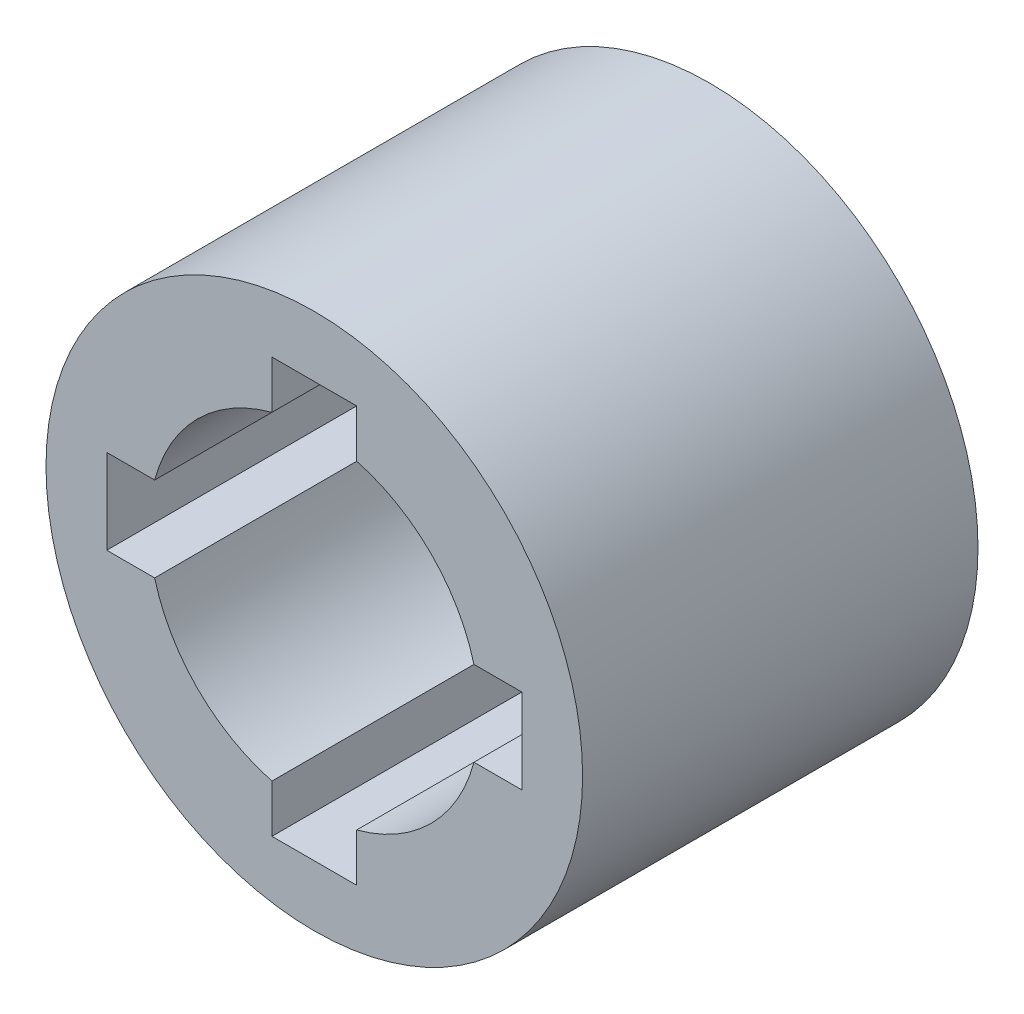
ISO-10303-21;
HEADER;
FILE_DESCRIPTION(('STEP AP214'),'2;1');
FILE_NAME('part.step','',(''),(''),'','','');
FILE_SCHEMA(('AUTOMOTIVE_DESIGN { 1 0 10303 214 1 1 1 1 }'));
ENDSEC;
DATA;
#1=APPLICATION_CONTEXT('core data for automotive mechanical design processes');
#2=APPLICATION_PROTOCOL_DEFINITION('international standard','automotive_design',2000,#1);
#3=PRODUCT_CONTEXT('',#1,'mechanical');
#4=PRODUCT('Part','Part','',(#3));
#5=PRODUCT_RELATED_PRODUCT_CATEGORY('part','',(#4));
#6=PRODUCT_DEFINITION_FORMATION('','',#4);
#7=PRODUCT_DEFINITION_CONTEXT('part definition',#1,'design');
#8=PRODUCT_DEFINITION('design','',#6,#7);
#9=PRODUCT_DEFINITION_SHAPE('','',#8);
#10=(LENGTH_UNIT() NAMED_UNIT(*) SI_UNIT(.MILLI.,.METRE.));
#11=(NAMED_UNIT(*) PLANE_ANGLE_UNIT() SI_UNIT($,.RADIAN.));
#12=(NAMED_UNIT(*) SI_UNIT($,.STERADIAN.) SOLID_ANGLE_UNIT());
#13=UNCERTAINTY_MEASURE_WITH_UNIT(LENGTH_MEASURE(1.E-05),#10,'distance_accuracy_value','');
#14=(GEOMETRIC_REPRESENTATION_CONTEXT(3) GLOBAL_UNCERTAINTY_ASSIGNED_CONTEXT((#13)) GLOBAL_UNIT_ASSIGNED_CONTEXT((#10,
#11,#12)) REPRESENTATION_CONTEXT('',''));
#15=CARTESIAN_POINT('',(0.,0.,0.));
#16=DIRECTION('',(0.,0.,1.));
#17=DIRECTION('',(1.,0.,0.));
#18=AXIS2_PLACEMENT_3D('',#15,#16,#17);
#19=CARTESIAN_POINT('',(0.,0.,14.));
#20=DIRECTION('',(0.,0.,1.));
#21=DIRECTION('',(1.,0.,0.));
#22=AXIS2_PLACEMENT_3D('',#19,#20,#21);
#23=PLANE('',#22);
#24=CARTESIAN_POINT('',(0.,0.,14.));
#25=DIRECTION('',(0.,0.,1.));
#26=DIRECTION('',(1.,0.,0.));
#27=AXIS2_PLACEMENT_3D('',#24,#25,#26);
#28=CIRCLE('',#27,9.5);
#29=CARTESIAN_POINT('',(9.5,0.,14.));
#30=VERTEX_POINT('',#29);
#31=EDGE_CURVE('E11',#30,#30,#28,.T.);
#32=ORIENTED_EDGE('',*,*,#31,.T.);
#33=EDGE_LOOP('',(#32));
#34=FACE_BOUND('',#33,.T.);
#35=DIRECTION('',(-1.,0.,0.));
#36=VECTOR('',#35,1.);
#37=CARTESIAN_POINT('',(-1.5,7.34846922834954,14.));
#38=LINE('',#37,#36);
#39=CARTESIAN_POINT('',(1.5,7.34846922834954,14.));
#40=VERTEX_POINT('',#39);
#41=CARTESIAN_POINT('',(-1.5,7.34846922834954,14.));
#42=VERTEX_POINT('',#41);
#43=EDGE_CURVE('E160',#40,#42,#38,.T.);
#44=ORIENTED_EDGE('',*,*,#43,.F.);
#45=DIRECTION('',(0.,1.,0.));
#46=VECTOR('',#45,1.);
#47=CARTESIAN_POINT('',(1.5,7.34846922834954,14.));
#48=LINE('',#47,#46);
#49=CARTESIAN_POINT('',(1.5,5.65283931444645,14.));
#50=VERTEX_POINT('',#49);
#51=EDGE_CURVE('E152',#50,#40,#48,.T.);
#52=ORIENTED_EDGE('',*,*,#51,.F.);
#53=CARTESIAN_POINT('',(0.,0.,14.));
#54=DIRECTION('',(0.,0.,1.));
#55=DIRECTION('',(1.,0.,0.));
#56=AXIS2_PLACEMENT_3D('',#53,#54,#55);
#57=CIRCLE('',#56,5.84846922834954);
#58=CARTESIAN_POINT('',(5.65283931444645,1.5,14.));
#59=VERTEX_POINT('',#58);
#60=EDGE_CURVE('E200',#59,#50,#57,.T.);
#61=ORIENTED_EDGE('',*,*,#60,.F.);
#62=DIRECTION('',(-1.,0.,0.));
#63=VECTOR('',#62,1.);
#64=CARTESIAN_POINT('',(5.65283931444645,1.5,14.));
#65=LINE('',#64,#63);
#66=CARTESIAN_POINT('',(7.34846922834954,1.5,14.));
#67=VERTEX_POINT('',#66);
#68=EDGE_CURVE('E198',#67,#59,#65,.T.);
#69=ORIENTED_EDGE('',*,*,#68,.F.);
#70=DIRECTION('',(0.,1.,0.));
#71=VECTOR('',#70,1.);
#72=CARTESIAN_POINT('',(7.34846922834954,1.5,14.));
#73=LINE('',#72,#71);
#74=CARTESIAN_POINT('',(7.34846922834954,-1.5,14.));
#75=VERTEX_POINT('',#74);
#76=EDGE_CURVE('E196',#75,#67,#73,.T.);
#77=ORIENTED_EDGE('',*,*,#76,.F.);
#78=DIRECTION('',(1.,0.,0.));
#79=VECTOR('',#78,1.);
#80=CARTESIAN_POINT('',(7.34846922834954,-1.5,14.));
#81=LINE('',#80,#79);
#82=CARTESIAN_POINT('',(5.65283931444645,-1.5,14.));
#83=VERTEX_POINT('',#82);
#84=EDGE_CURVE('E194',#83,#75,#81,.T.);
#85=ORIENTED_EDGE('',*,*,#84,.F.);
#86=CARTESIAN_POINT('',(0.,0.,14.));
#87=DIRECTION('',(0.,0.,1.));
#88=DIRECTION('',(1.,0.,0.));
#89=AXIS2_PLACEMENT_3D('',#86,#87,#88);
#90=CIRCLE('',#89,5.84846922834954);
#91=CARTESIAN_POINT('',(1.5,-5.65283931444645,14.));
#92=VERTEX_POINT('',#91);
#93=EDGE_CURVE('E192',#92,#83,#90,.T.);
#94=ORIENTED_EDGE('',*,*,#93,.F.);
#95=DIRECTION('',(0.,1.,0.));
#96=VECTOR('',#95,1.);
#97=CARTESIAN_POINT('',(1.5,-5.65283931444645,14.));
#98=LINE('',#97,#96);
#99=CARTESIAN_POINT('',(1.5,-7.34846922834954,14.));
#100=VERTEX_POINT('',#99);
#101=EDGE_CURVE('E190',#100,#92,#98,.T.);
#102=ORIENTED_EDGE('',*,*,#101,.F.);
#103=DIRECTION('',(1.,0.,0.));
#104=VECTOR('',#103,1.);
#105=CARTESIAN_POINT('',(1.5,-7.34846922834954,14.));
#106=LINE('',#105,#104);
#107=CARTESIAN_POINT('',(-1.5,-7.34846922834954,14.));
#108=VERTEX_POINT('',#107);
#109=EDGE_CURVE('E188',#108,#100,#106,.T.);
#110=ORIENTED_EDGE('',*,*,#109,.F.);
#111=DIRECTION('',(0.,-1.,0.));
#112=VECTOR('',#111,1.);
#113=CARTESIAN_POINT('',(-1.5,-7.34846922834954,14.));
#114=LINE('',#113,#112);
#115=CARTESIAN_POINT('',(-1.5,-5.65283931444645,14.));
#116=VERTEX_POINT('',#115);
#117=EDGE_CURVE('E186',#116,#108,#114,.T.);
#118=ORIENTED_EDGE('',*,*,#117,.F.);
#119=CARTESIAN_POINT('',(0.,0.,14.));
#120=DIRECTION('',(0.,0.,1.));
#121=DIRECTION('',(1.,0.,0.));
#122=AXIS2_PLACEMENT_3D('',#119,#120,#121);
#123=CIRCLE('',#122,5.84846922834954);
#124=CARTESIAN_POINT('',(-5.65283931444645,-1.5,14.));
#125=VERTEX_POINT('',#124);
#126=EDGE_CURVE('E184',#125,#116,#123,.T.);
#127=ORIENTED_EDGE('',*,*,#126,.F.);
#128=DIRECTION('',(1.,0.,0.));
#129=VECTOR('',#128,1.);
#130=CARTESIAN_POINT('',(-5.65283931444645,-1.5,14.));
#131=LINE('',#130,#129);
#132=CARTESIAN_POINT('',(-7.34846922834954,-1.5,14.));
#133=VERTEX_POINT('',#132);
#134=EDGE_CURVE('E182',#133,#125,#131,.T.);
#135=ORIENTED_EDGE('',*,*,#134,.F.);
#136=DIRECTION('',(0.,-1.,0.));
#137=VECTOR('',#136,1.);
#138=CARTESIAN_POINT('',(-7.34846922834954,-1.5,14.));
#139=LINE('',#138,#137);
#140=CARTESIAN_POINT('',(-7.34846922834954,1.5,14.));
#141=VERTEX_POINT('',#140);
#142=EDGE_CURVE('E180',#141,#133,#139,.T.);
#143=ORIENTED_EDGE('',*,*,#142,.F.);
#144=DIRECTION('',(-1.,0.,0.));
#145=VECTOR('',#144,1.);
#146=CARTESIAN_POINT('',(-7.34846922834954,1.5,14.));
#147=LINE('',#146,#145);
#148=CARTESIAN_POINT('',(-5.65283931444645,1.5,14.));
#149=VERTEX_POINT('',#148);
#150=EDGE_CURVE('E178',#149,#141,#147,.T.);
#151=ORIENTED_EDGE('',*,*,#150,.F.);
#152=CARTESIAN_POINT('',(0.,0.,14.));
#153=DIRECTION('',(0.,0.,1.));
#154=DIRECTION('',(1.,0.,0.));
#155=AXIS2_PLACEMENT_3D('',#152,#153,#154);
#156=CIRCLE('',#155,5.84846922834954);
#157=CARTESIAN_POINT('',(-1.5,5.65283931444645,14.));
#158=VERTEX_POINT('',#157);
#159=EDGE_CURVE('E174',#158,#149,#156,.T.);
#160=ORIENTED_EDGE('',*,*,#159,.F.);
#161=DIRECTION('',(0.,-1.,0.));
#162=VECTOR('',#161,1.);
#163=CARTESIAN_POINT('',(-1.5,5.65283931444645,14.));
#164=LINE('',#163,#162);
#165=EDGE_CURVE('E172',#42,#158,#164,.T.);
#166=ORIENTED_EDGE('',*,*,#165,.F.);
#167=EDGE_LOOP('',(#44,#52,#61,#69,#77,#85,#94,#102,#110,#118,#127,#135,#143,#151,#160,#166));
#168=FACE_BOUND('',#167,.T.);
#169=ADVANCED_FACE('F39',(#34,#168),#23,.T.);
#170=CARTESIAN_POINT('',(0.,0.,0.));
#171=DIRECTION('',(0.,0.,1.));
#172=DIRECTION('',(1.,0.,0.));
#173=AXIS2_PLACEMENT_3D('',#170,#171,#172);
#174=PLANE('',#173);
#175=CARTESIAN_POINT('',(0.,0.,0.));
#176=DIRECTION('',(0.,0.,1.));
#177=DIRECTION('',(1.,0.,0.));
#178=AXIS2_PLACEMENT_3D('',#175,#176,#177);
#179=CIRCLE('',#178,9.5);
#180=CARTESIAN_POINT('',(9.5,0.,0.));
#181=VERTEX_POINT('',#180);
#182=EDGE_CURVE('E43',#181,#181,#179,.T.);
#183=ORIENTED_EDGE('',*,*,#182,.F.);
#184=EDGE_LOOP('',(#183));
#185=FACE_BOUND('',#184,.T.);
#186=DIRECTION('',(0.,1.,0.));
#187=VECTOR('',#186,1.);
#188=CARTESIAN_POINT('',(1.5,7.34846922834954,0.));
#189=LINE('',#188,#187);
#190=CARTESIAN_POINT('',(1.5,5.65283931444645,0.));
#191=VERTEX_POINT('',#190);
#192=CARTESIAN_POINT('',(1.5,7.34846922834954,0.));
#193=VERTEX_POINT('',#192);
#194=EDGE_CURVE('E62',#191,#193,#189,.T.);
#195=ORIENTED_EDGE('',*,*,#194,.T.);
#196=DIRECTION('',(-1.,0.,0.));
#197=VECTOR('',#196,1.);
#198=CARTESIAN_POINT('',(-1.5,7.34846922834954,0.));
#199=LINE('',#198,#197);
#200=CARTESIAN_POINT('',(-1.5,7.34846922834954,0.));
#201=VERTEX_POINT('',#200);
#202=EDGE_CURVE('E167',#193,#201,#199,.T.);
#203=ORIENTED_EDGE('',*,*,#202,.T.);
#204=DIRECTION('',(0.,-1.,0.));
#205=VECTOR('',#204,1.);
#206=CARTESIAN_POINT('',(-1.5,5.65283931444645,0.));
#207=LINE('',#206,#205);
#208=CARTESIAN_POINT('',(-1.5,5.65283931444645,0.));
#209=VERTEX_POINT('',#208);
#210=EDGE_CURVE('E204',#201,#209,#207,.T.);
#211=ORIENTED_EDGE('',*,*,#210,.T.);
#212=CARTESIAN_POINT('',(0.,0.,0.));
#213=DIRECTION('',(0.,0.,1.));
#214=DIRECTION('',(1.,0.,0.));
#215=AXIS2_PLACEMENT_3D('',#212,#213,#214);
#216=CIRCLE('',#215,5.84846922834954);
#217=CARTESIAN_POINT('',(-5.65283931444645,1.5,0.));
#218=VERTEX_POINT('',#217);
#219=EDGE_CURVE('E207',#209,#218,#216,.T.);
#220=ORIENTED_EDGE('',*,*,#219,.T.);
#221=DIRECTION('',(-1.,0.,0.));
#222=VECTOR('',#221,1.);
#223=CARTESIAN_POINT('',(-7.34846922834954,1.5,0.));
#224=LINE('',#223,#222);
#225=CARTESIAN_POINT('',(-7.34846922834954,1.5,0.));
#226=VERTEX_POINT('',#225);
#227=EDGE_CURVE('E210',#218,#226,#224,.T.);
#228=ORIENTED_EDGE('',*,*,#227,.T.);
#229=DIRECTION('',(0.,-1.,0.));
#230=VECTOR('',#229,1.);
#231=CARTESIAN_POINT('',(-7.34846922834954,-1.5,0.));
#232=LINE('',#231,#230);
#233=CARTESIAN_POINT('',(-7.34846922834954,-1.5,0.));
#234=VERTEX_POINT('',#233);
#235=EDGE_CURVE('E213',#226,#234,#232,.T.);
#236=ORIENTED_EDGE('',*,*,#235,.T.);
#237=DIRECTION('',(1.,0.,0.));
#238=VECTOR('',#237,1.);
#239=CARTESIAN_POINT('',(-5.65283931444645,-1.5,0.));
#240=LINE('',#239,#238);
#241=CARTESIAN_POINT('',(-5.65283931444645,-1.5,0.));
#242=VERTEX_POINT('',#241);
#243=EDGE_CURVE('E216',#234,#242,#240,.T.);
#244=ORIENTED_EDGE('',*,*,#243,.T.);
#245=CARTESIAN_POINT('',(0.,0.,0.));
#246=DIRECTION('',(0.,0.,1.));
#247=DIRECTION('',(1.,0.,0.));
#248=AXIS2_PLACEMENT_3D('',#245,#246,#247);
#249=CIRCLE('',#248,5.84846922834954);
#250=CARTESIAN_POINT('',(-1.5,-5.65283931444645,0.));
#251=VERTEX_POINT('',#250);
#252=EDGE_CURVE('E219',#242,#251,#249,.T.);
#253=ORIENTED_EDGE('',*,*,#252,.T.);
#254=DIRECTION('',(0.,-1.,0.));
#255=VECTOR('',#254,1.);
#256=CARTESIAN_POINT('',(-1.5,-7.34846922834954,0.));
#257=LINE('',#256,#255);
#258=CARTESIAN_POINT('',(-1.5,-7.34846922834954,0.));
#259=VERTEX_POINT('',#258);
#260=EDGE_CURVE('E222',#251,#259,#257,.T.);
#261=ORIENTED_EDGE('',*,*,#260,.T.);
#262=DIRECTION('',(1.,0.,0.));
#263=VECTOR('',#262,1.);
#264=CARTESIAN_POINT('',(1.5,-7.34846922834954,0.));
#265=LINE('',#264,#263);
#266=CARTESIAN_POINT('',(1.5,-7.34846922834954,0.));
#267=VERTEX_POINT('',#266);
#268=EDGE_CURVE('E225',#259,#267,#265,.T.);
#269=ORIENTED_EDGE('',*,*,#268,.T.);
#270=DIRECTION('',(0.,1.,0.));
#271=VECTOR('',#270,1.);
#272=CARTESIAN_POINT('',(1.5,-5.65283931444645,0.));
#273=LINE('',#272,#271);
#274=CARTESIAN_POINT('',(1.5,-5.65283931444645,0.));
#275=VERTEX_POINT('',#274);
#276=EDGE_CURVE('E228',#267,#275,#273,.T.);
#277=ORIENTED_EDGE('',*,*,#276,.T.);
#278=CARTESIAN_POINT('',(0.,0.,0.));
#279=DIRECTION('',(0.,0.,1.));
#280=DIRECTION('',(1.,0.,0.));
#281=AXIS2_PLACEMENT_3D('',#278,#279,#280);
#282=CIRCLE('',#281,5.84846922834954);
#283=CARTESIAN_POINT('',(5.65283931444645,-1.5,0.));
#284=VERTEX_POINT('',#283);
#285=EDGE_CURVE('E231',#275,#284,#282,.T.);
#286=ORIENTED_EDGE('',*,*,#285,.T.);
#287=DIRECTION('',(1.,0.,0.));
#288=VECTOR('',#287,1.);
#289=CARTESIAN_POINT('',(7.34846922834954,-1.5,0.));
#290=LINE('',#289,#288);
#291=CARTESIAN_POINT('',(7.34846922834954,-1.5,0.));
#292=VERTEX_POINT('',#291);
#293=EDGE_CURVE('E234',#284,#292,#290,.T.);
#294=ORIENTED_EDGE('',*,*,#293,.T.);
#295=DIRECTION('',(0.,1.,0.));
#296=VECTOR('',#295,1.);
#297=CARTESIAN_POINT('',(7.34846922834954,1.5,0.));
#298=LINE('',#297,#296);
#299=CARTESIAN_POINT('',(7.34846922834954,1.5,0.));
#300=VERTEX_POINT('',#299);
#301=EDGE_CURVE('E237',#292,#300,#298,.T.);
#302=ORIENTED_EDGE('',*,*,#301,.T.);
#303=DIRECTION('',(-1.,0.,0.));
#304=VECTOR('',#303,1.);
#305=CARTESIAN_POINT('',(5.65283931444645,1.5,0.));
#306=LINE('',#305,#304);
#307=CARTESIAN_POINT('',(5.65283931444645,1.5,0.));
#308=VERTEX_POINT('',#307);
#309=EDGE_CURVE('E240',#300,#308,#306,.T.);
#310=ORIENTED_EDGE('',*,*,#309,.T.);
#311=CARTESIAN_POINT('',(0.,0.,0.));
#312=DIRECTION('',(0.,0.,1.));
#313=DIRECTION('',(1.,0.,0.));
#314=AXIS2_PLACEMENT_3D('',#311,#312,#313);
#315=CIRCLE('',#314,5.84846922834954);
#316=EDGE_CURVE('E161',#308,#191,#315,.T.);
#317=ORIENTED_EDGE('',*,*,#316,.T.);
#318=EDGE_LOOP('',(#195,#203,#211,#220,#228,#236,#244,#253,#261,#269,#277,#286,#294,#302,#310,#317));
#319=FACE_BOUND('',#318,.T.);
#320=ADVANCED_FACE('F277',(#185,#319),#174,.F.);
#321=CARTESIAN_POINT('',(0.,0.,14.));
#322=DIRECTION('',(0.,0.,-1.));
#323=DIRECTION('',(-1.,0.,0.));
#324=AXIS2_PLACEMENT_3D('',#321,#322,#323);
#325=CYLINDRICAL_SURFACE('',#324,9.5);
#326=ORIENTED_EDGE('',*,*,#31,.F.);
#327=EDGE_LOOP('',(#326));
#328=FACE_BOUND('',#327,.T.);
#329=ORIENTED_EDGE('',*,*,#182,.T.);
#330=EDGE_LOOP('',(#329));
#331=FACE_BOUND('',#330,.T.);
#332=ADVANCED_FACE('F41',(#328,#331),#325,.T.);
#333=CARTESIAN_POINT('',(1.5,7.34846922834954,14.));
#334=DIRECTION('',(-1.,0.,0.));
#335=DIRECTION('',(0.,0.,1.));
#336=AXIS2_PLACEMENT_3D('',#333,#334,#335);
#337=PLANE('',#336);
#338=ORIENTED_EDGE('',*,*,#194,.F.);
#339=DIRECTION('',(0.,0.,-1.));
#340=VECTOR('',#339,1.);
#341=CARTESIAN_POINT('',(1.5,5.65283931444645,14.));
#342=LINE('',#341,#340);
#343=EDGE_CURVE('E156',#50,#191,#342,.T.);
#344=ORIENTED_EDGE('',*,*,#343,.F.);
#345=ORIENTED_EDGE('',*,*,#51,.T.);
#346=DIRECTION('',(0.,0.,-1.));
#347=VECTOR('',#346,1.);
#348=CARTESIAN_POINT('',(1.5,7.34846922834954,14.));
#349=LINE('',#348,#347);
#350=EDGE_CURVE('E155',#40,#193,#349,.T.);
#351=ORIENTED_EDGE('',*,*,#350,.T.);
#352=EDGE_LOOP('',(#338,#344,#345,#351));
#353=FACE_BOUND('',#352,.T.);
#354=ADVANCED_FACE('F154',(#353),#337,.T.);
#355=CARTESIAN_POINT('',(-1.5,7.34846922834954,14.));
#356=DIRECTION('',(0.,-1.,0.));
#357=DIRECTION('',(0.,0.,-1.));
#358=AXIS2_PLACEMENT_3D('',#355,#356,#357);
#359=PLANE('',#358);
#360=ORIENTED_EDGE('',*,*,#202,.F.);
#361=ORIENTED_EDGE('',*,*,#350,.F.);
#362=ORIENTED_EDGE('',*,*,#43,.T.);
#363=DIRECTION('',(0.,0.,-1.));
#364=VECTOR('',#363,1.);
#365=CARTESIAN_POINT('',(-1.5,7.34846922834954,14.));
#366=LINE('',#365,#364);
#367=EDGE_CURVE('E168',#42,#201,#366,.T.);
#368=ORIENTED_EDGE('',*,*,#367,.T.);
#369=EDGE_LOOP('',(#360,#361,#362,#368));
#370=FACE_BOUND('',#369,.T.);
#371=ADVANCED_FACE('F164',(#370),#359,.T.);
#372=CARTESIAN_POINT('',(-1.5,5.65283931444645,14.));
#373=DIRECTION('',(1.,0.,0.));
#374=DIRECTION('',(0.,0.,-1.));
#375=AXIS2_PLACEMENT_3D('',#372,#373,#374);
#376=PLANE('',#375);
#377=ORIENTED_EDGE('',*,*,#210,.F.);
#378=ORIENTED_EDGE('',*,*,#367,.F.);
#379=ORIENTED_EDGE('',*,*,#165,.T.);
#380=DIRECTION('',(0.,0.,-1.));
#381=VECTOR('',#380,1.);
#382=CARTESIAN_POINT('',(-1.5,5.65283931444645,14.));
#383=LINE('',#382,#381);
#384=EDGE_CURVE('E269',#158,#209,#383,.T.);
#385=ORIENTED_EDGE('',*,*,#384,.T.);
#386=EDGE_LOOP('',(#377,#378,#379,#385));
#387=FACE_BOUND('',#386,.T.);
#388=ADVANCED_FACE('F273',(#387),#376,.T.);
#389=CARTESIAN_POINT('',(0.,0.,14.));
#390=DIRECTION('',(0.,0.,-1.));
#391=DIRECTION('',(-1.,0.,0.));
#392=AXIS2_PLACEMENT_3D('',#389,#390,#391);
#393=CYLINDRICAL_SURFACE('',#392,5.84846922834954);
#394=ORIENTED_EDGE('',*,*,#219,.F.);
#395=ORIENTED_EDGE('',*,*,#384,.F.);
#396=ORIENTED_EDGE('',*,*,#159,.T.);
#397=DIRECTION('',(0.,0.,-1.));
#398=VECTOR('',#397,1.);
#399=CARTESIAN_POINT('',(-5.65283931444645,1.5,14.));
#400=LINE('',#399,#398);
#401=EDGE_CURVE('E267',#149,#218,#400,.T.);
#402=ORIENTED_EDGE('',*,*,#401,.T.);
#403=EDGE_LOOP('',(#394,#395,#396,#402));
#404=FACE_BOUND('',#403,.T.);
#405=ADVANCED_FACE('F335',(#404),#393,.F.);
#406=CARTESIAN_POINT('',(-7.34846922834954,1.5,14.));
#407=DIRECTION('',(0.,-1.,0.));
#408=DIRECTION('',(0.,0.,-1.));
#409=AXIS2_PLACEMENT_3D('',#406,#407,#408);
#410=PLANE('',#409);
#411=ORIENTED_EDGE('',*,*,#227,.F.);
#412=ORIENTED_EDGE('',*,*,#401,.F.);
#413=ORIENTED_EDGE('',*,*,#150,.T.);
#414=DIRECTION('',(0.,0.,-1.));
#415=VECTOR('',#414,1.);
#416=CARTESIAN_POINT('',(-7.34846922834954,1.5,14.));
#417=LINE('',#416,#415);
#418=EDGE_CURVE('E265',#141,#226,#417,.T.);
#419=ORIENTED_EDGE('',*,*,#418,.T.);
#420=EDGE_LOOP('',(#411,#412,#413,#419));
#421=FACE_BOUND('',#420,.T.);
#422=ADVANCED_FACE('F332',(#421),#410,.T.);
#423=CARTESIAN_POINT('',(-7.34846922834954,-1.5,14.));
#424=DIRECTION('',(1.,0.,0.));
#425=DIRECTION('',(0.,0.,-1.));
#426=AXIS2_PLACEMENT_3D('',#423,#424,#425);
#427=PLANE('',#426);
#428=ORIENTED_EDGE('',*,*,#235,.F.);
#429=ORIENTED_EDGE('',*,*,#418,.F.);
#430=ORIENTED_EDGE('',*,*,#142,.T.);
#431=DIRECTION('',(0.,0.,-1.));
#432=VECTOR('',#431,1.);
#433=CARTESIAN_POINT('',(-7.34846922834954,-1.5,14.));
#434=LINE('',#433,#432);
#435=EDGE_CURVE('E263',#133,#234,#434,.T.);
#436=ORIENTED_EDGE('',*,*,#435,.T.);
#437=EDGE_LOOP('',(#428,#429,#430,#436));
#438=FACE_BOUND('',#437,.T.);
#439=ADVANCED_FACE('F329',(#438),#427,.T.);
#440=CARTESIAN_POINT('',(-5.65283931444645,-1.5,14.));
#441=DIRECTION('',(0.,1.,0.));
#442=DIRECTION('',(0.,0.,1.));
#443=AXIS2_PLACEMENT_3D('',#440,#441,#442);
#444=PLANE('',#443);
#445=ORIENTED_EDGE('',*,*,#243,.F.);
#446=ORIENTED_EDGE('',*,*,#435,.F.);
#447=ORIENTED_EDGE('',*,*,#134,.T.);
#448=DIRECTION('',(0.,0.,-1.));
#449=VECTOR('',#448,1.);
#450=CARTESIAN_POINT('',(-5.65283931444645,-1.5,14.));
#451=LINE('',#450,#449);
#452=EDGE_CURVE('E261',#125,#242,#451,.T.);
#453=ORIENTED_EDGE('',*,*,#452,.T.);
#454=EDGE_LOOP('',(#445,#446,#447,#453));
#455=FACE_BOUND('',#454,.T.);
#456=ADVANCED_FACE('F322',(#455),#444,.T.);
#457=CARTESIAN_POINT('',(0.,0.,14.));
#458=DIRECTION('',(0.,0.,-1.));
#459=DIRECTION('',(-1.,0.,0.));
#460=AXIS2_PLACEMENT_3D('',#457,#458,#459);
#461=CYLINDRICAL_SURFACE('',#460,5.84846922834954);
#462=ORIENTED_EDGE('',*,*,#252,.F.);
#463=ORIENTED_EDGE('',*,*,#452,.F.);
#464=ORIENTED_EDGE('',*,*,#126,.T.);
#465=DIRECTION('',(0.,0.,-1.));
#466=VECTOR('',#465,1.);
#467=CARTESIAN_POINT('',(-1.5,-5.65283931444645,14.));
#468=LINE('',#467,#466);
#469=EDGE_CURVE('E259',#116,#251,#468,.T.);
#470=ORIENTED_EDGE('',*,*,#469,.T.);
#471=EDGE_LOOP('',(#462,#463,#464,#470));
#472=FACE_BOUND('',#471,.T.);
#473=ADVANCED_FACE('F318',(#472),#461,.F.);
#474=CARTESIAN_POINT('',(-1.5,-7.34846922834954,14.));
#475=DIRECTION('',(1.,0.,0.));
#476=DIRECTION('',(0.,0.,-1.));
#477=AXIS2_PLACEMENT_3D('',#474,#475,#476);
#478=PLANE('',#477);
#479=ORIENTED_EDGE('',*,*,#260,.F.);
#480=ORIENTED_EDGE('',*,*,#469,.F.);
#481=ORIENTED_EDGE('',*,*,#117,.T.);
#482=DIRECTION('',(0.,0.,-1.));
#483=VECTOR('',#482,1.);
#484=CARTESIAN_POINT('',(-1.5,-7.34846922834954,14.));
#485=LINE('',#484,#483);
#486=EDGE_CURVE('E257',#108,#259,#485,.T.);
#487=ORIENTED_EDGE('',*,*,#486,.T.);
#488=EDGE_LOOP('',(#479,#480,#481,#487));
#489=FACE_BOUND('',#488,.T.);
#490=ADVANCED_FACE('F315',(#489),#478,.T.);
#491=CARTESIAN_POINT('',(1.5,-7.34846922834954,14.));
#492=DIRECTION('',(0.,1.,0.));
#493=DIRECTION('',(0.,0.,1.));
#494=AXIS2_PLACEMENT_3D('',#491,#492,#493);
#495=PLANE('',#494);
#496=ORIENTED_EDGE('',*,*,#268,.F.);
#497=ORIENTED_EDGE('',*,*,#486,.F.);
#498=ORIENTED_EDGE('',*,*,#109,.T.);
#499=DIRECTION('',(0.,0.,-1.));
#500=VECTOR('',#499,1.);
#501=CARTESIAN_POINT('',(1.5,-7.34846922834954,14.));
#502=LINE('',#501,#500);
#503=EDGE_CURVE('E255',#100,#267,#502,.T.);
#504=ORIENTED_EDGE('',*,*,#503,.T.);
#505=EDGE_LOOP('',(#496,#497,#498,#504));
#506=FACE_BOUND('',#505,.T.);
#507=ADVANCED_FACE('F307',(#506),#495,.T.);
#508=CARTESIAN_POINT('',(1.5,-5.65283931444645,14.));
#509=DIRECTION('',(-1.,0.,0.));
#510=DIRECTION('',(0.,0.,1.));
#511=AXIS2_PLACEMENT_3D('',#508,#509,#510);
#512=PLANE('',#511);
#513=ORIENTED_EDGE('',*,*,#276,.F.);
#514=ORIENTED_EDGE('',*,*,#503,.F.);
#515=ORIENTED_EDGE('',*,*,#101,.T.);
#516=DIRECTION('',(0.,0.,-1.));
#517=VECTOR('',#516,1.);
#518=CARTESIAN_POINT('',(1.5,-5.65283931444645,14.));
#519=LINE('',#518,#517);
#520=EDGE_CURVE('E253',#92,#275,#519,.T.);
#521=ORIENTED_EDGE('',*,*,#520,.T.);
#522=EDGE_LOOP('',(#513,#514,#515,#521));
#523=FACE_BOUND('',#522,.T.);
#524=ADVANCED_FACE('F303',(#523),#512,.T.);
#525=CARTESIAN_POINT('',(0.,0.,14.));
#526=DIRECTION('',(0.,0.,-1.));
#527=DIRECTION('',(-1.,0.,0.));
#528=AXIS2_PLACEMENT_3D('',#525,#526,#527);
#529=CYLINDRICAL_SURFACE('',#528,5.84846922834954);
#530=ORIENTED_EDGE('',*,*,#285,.F.);
#531=ORIENTED_EDGE('',*,*,#520,.F.);
#532=ORIENTED_EDGE('',*,*,#93,.T.);
#533=DIRECTION('',(0.,0.,-1.));
#534=VECTOR('',#533,1.);
#535=CARTESIAN_POINT('',(5.65283931444645,-1.5,14.));
#536=LINE('',#535,#534);
#537=EDGE_CURVE('E251',#83,#284,#536,.T.);
#538=ORIENTED_EDGE('',*,*,#537,.T.);
#539=EDGE_LOOP('',(#530,#531,#532,#538));
#540=FACE_BOUND('',#539,.T.);
#541=ADVANCED_FACE('F300',(#540),#529,.F.);
#542=CARTESIAN_POINT('',(7.34846922834954,-1.5,14.));
#543=DIRECTION('',(0.,1.,0.));
#544=DIRECTION('',(0.,0.,1.));
#545=AXIS2_PLACEMENT_3D('',#542,#543,#544);
#546=PLANE('',#545);
#547=ORIENTED_EDGE('',*,*,#293,.F.);
#548=ORIENTED_EDGE('',*,*,#537,.F.);
#549=ORIENTED_EDGE('',*,*,#84,.T.);
#550=DIRECTION('',(0.,0.,-1.));
#551=VECTOR('',#550,1.);
#552=CARTESIAN_POINT('',(7.34846922834954,-1.5,14.));
#553=LINE('',#552,#551);
#554=EDGE_CURVE('E249',#75,#292,#553,.T.);
#555=ORIENTED_EDGE('',*,*,#554,.T.);
#556=EDGE_LOOP('',(#547,#548,#549,#555));
#557=FACE_BOUND('',#556,.T.);
#558=ADVANCED_FACE('F292',(#557),#546,.T.);
#559=CARTESIAN_POINT('',(7.34846922834954,1.5,14.));
#560=DIRECTION('',(-1.,0.,0.));
#561=DIRECTION('',(0.,0.,1.));
#562=AXIS2_PLACEMENT_3D('',#559,#560,#561);
#563=PLANE('',#562);
#564=ORIENTED_EDGE('',*,*,#301,.F.);
#565=ORIENTED_EDGE('',*,*,#554,.F.);
#566=ORIENTED_EDGE('',*,*,#76,.T.);
#567=DIRECTION('',(0.,0.,-1.));
#568=VECTOR('',#567,1.);
#569=CARTESIAN_POINT('',(7.34846922834954,1.5,14.));
#570=LINE('',#569,#568);
#571=EDGE_CURVE('E247',#67,#300,#570,.T.);
#572=ORIENTED_EDGE('',*,*,#571,.T.);
#573=EDGE_LOOP('',(#564,#565,#566,#572));
#574=FACE_BOUND('',#573,.T.);
#575=ADVANCED_FACE('F288',(#574),#563,.T.);
#576=CARTESIAN_POINT('',(5.65283931444645,1.5,14.));
#577=DIRECTION('',(0.,-1.,0.));
#578=DIRECTION('',(0.,0.,-1.));
#579=AXIS2_PLACEMENT_3D('',#576,#577,#578);
#580=PLANE('',#579);
#581=ORIENTED_EDGE('',*,*,#309,.F.);
#582=ORIENTED_EDGE('',*,*,#571,.F.);
#583=ORIENTED_EDGE('',*,*,#68,.T.);
#584=DIRECTION('',(0.,0.,-1.));
#585=VECTOR('',#584,1.);
#586=CARTESIAN_POINT('',(5.65283931444645,1.5,14.));
#587=LINE('',#586,#585);
#588=EDGE_CURVE('E54',#59,#308,#587,.T.);
#589=ORIENTED_EDGE('',*,*,#588,.T.);
#590=EDGE_LOOP('',(#581,#582,#583,#589));
#591=FACE_BOUND('',#590,.T.);
#592=ADVANCED_FACE('F285',(#591),#580,.T.);
#593=CARTESIAN_POINT('',(0.,0.,14.));
#594=DIRECTION('',(0.,0.,-1.));
#595=DIRECTION('',(-1.,0.,0.));
#596=AXIS2_PLACEMENT_3D('',#593,#594,#595);
#597=CYLINDRICAL_SURFACE('',#596,5.84846922834954);
#598=ORIENTED_EDGE('',*,*,#316,.F.);
#599=ORIENTED_EDGE('',*,*,#588,.F.);
#600=ORIENTED_EDGE('',*,*,#60,.T.);
#601=ORIENTED_EDGE('',*,*,#343,.T.);
#602=EDGE_LOOP('',(#598,#599,#600,#601));
#603=FACE_BOUND('',#602,.T.);
#604=ADVANCED_FACE('F279',(#603),#597,.F.);
#605=CLOSED_SHELL('',(#169,#320,#332,#354,#371,#388,#405,#422,#439,#456,#473,#490,#507,#524,
#541,#558,#575,#592,#604));
#606=MANIFOLD_SOLID_BREP('B2',#605);
#607=ADVANCED_BREP_SHAPE_REPRESENTATION('',(#18,#606),#14);
#608=SHAPE_DEFINITION_REPRESENTATION(#9,#607);
ENDSEC;
END-ISO-10303-21;
